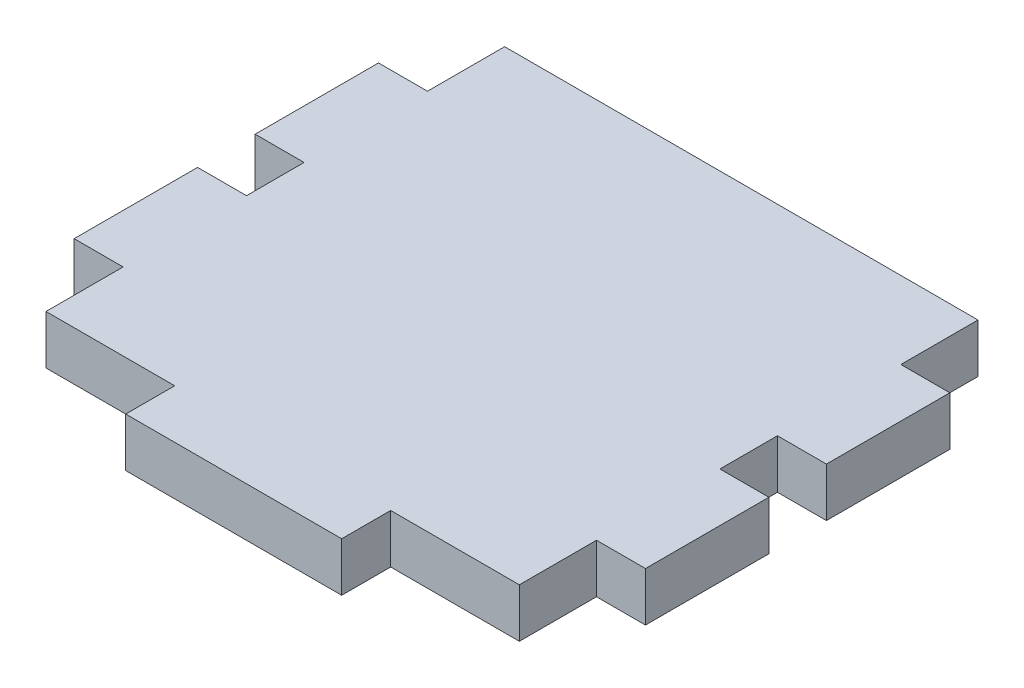
ISO-10303-21;
HEADER;
FILE_DESCRIPTION(('STEP AP214'),'2;1');
FILE_NAME('part.step','',(''),(''),'','','');
FILE_SCHEMA(('AUTOMOTIVE_DESIGN { 1 0 10303 214 1 1 1 1 }'));
ENDSEC;
DATA;
#1=APPLICATION_CONTEXT('core data for automotive mechanical design processes');
#2=APPLICATION_PROTOCOL_DEFINITION('international standard','automotive_design',2000,#1);
#3=PRODUCT_CONTEXT('',#1,'mechanical');
#4=PRODUCT('Part','Part','',(#3));
#5=PRODUCT_RELATED_PRODUCT_CATEGORY('part','',(#4));
#6=PRODUCT_DEFINITION_FORMATION('','',#4);
#7=PRODUCT_DEFINITION_CONTEXT('part definition',#1,'design');
#8=PRODUCT_DEFINITION('design','',#6,#7);
#9=PRODUCT_DEFINITION_SHAPE('','',#8);
#10=(LENGTH_UNIT() NAMED_UNIT(*) SI_UNIT(.MILLI.,.METRE.));
#11=(NAMED_UNIT(*) PLANE_ANGLE_UNIT() SI_UNIT($,.RADIAN.));
#12=(NAMED_UNIT(*) SI_UNIT($,.STERADIAN.) SOLID_ANGLE_UNIT());
#13=UNCERTAINTY_MEASURE_WITH_UNIT(LENGTH_MEASURE(1.E-05),#10,'distance_accuracy_value','');
#14=(GEOMETRIC_REPRESENTATION_CONTEXT(3) GLOBAL_UNCERTAINTY_ASSIGNED_CONTEXT((#13)) GLOBAL_UNIT_ASSIGNED_CONTEXT((#10,
#11,#12)) REPRESENTATION_CONTEXT('',''));
#15=CARTESIAN_POINT('',(0.,0.,0.));
#16=DIRECTION('',(0.,0.,1.));
#17=DIRECTION('',(1.,0.,0.));
#18=AXIS2_PLACEMENT_3D('',#15,#16,#17);
#19=CARTESIAN_POINT('',(0.,3.175,14.865));
#20=DIRECTION('',(0.,0.,-1.));
#21=DIRECTION('',(-1.,0.,0.));
#22=AXIS2_PLACEMENT_3D('',#19,#20,#21);
#23=PLANE('',#22);
#24=DIRECTION('',(0.,-1.,0.));
#25=VECTOR('',#24,1.);
#26=CARTESIAN_POINT('',(-7.,0.,14.865));
#27=LINE('',#26,#25);
#28=CARTESIAN_POINT('',(-7.,3.175,14.865));
#29=VERTEX_POINT('',#28);
#30=CARTESIAN_POINT('',(-7.,0.,14.865));
#31=VERTEX_POINT('',#30);
#32=EDGE_CURVE('E134',#29,#31,#27,.T.);
#33=ORIENTED_EDGE('',*,*,#32,.F.);
#34=DIRECTION('',(1.,0.,0.));
#35=VECTOR('',#34,1.);
#36=CARTESIAN_POINT('',(0.,3.175,14.865));
#37=LINE('',#36,#35);
#38=CARTESIAN_POINT('',(-15.3423,3.175,14.865));
#39=VERTEX_POINT('',#38);
#40=EDGE_CURVE('E330',#39,#29,#37,.T.);
#41=ORIENTED_EDGE('',*,*,#40,.F.);
#42=DIRECTION('',(0.,-1.,0.));
#43=VECTOR('',#42,1.);
#44=CARTESIAN_POINT('',(-15.3423,3.175,14.865));
#45=LINE('',#44,#43);
#46=CARTESIAN_POINT('',(-15.3423,0.,14.865));
#47=VERTEX_POINT('',#46);
#48=EDGE_CURVE('E430',#39,#47,#45,.T.);
#49=ORIENTED_EDGE('',*,*,#48,.T.);
#50=DIRECTION('',(1.,0.,0.));
#51=VECTOR('',#50,1.);
#52=CARTESIAN_POINT('',(0.,0.,14.865));
#53=LINE('',#52,#51);
#54=EDGE_CURVE('E375',#47,#31,#53,.T.);
#55=ORIENTED_EDGE('',*,*,#54,.T.);
#56=EDGE_LOOP('',(#33,#41,#49,#55));
#57=FACE_BOUND('',#56,.T.);
#58=ADVANCED_FACE('F111',(#57),#23,.F.);
#59=CARTESIAN_POINT('',(0.,3.175,9.865));
#60=DIRECTION('',(0.,0.,1.));
#61=DIRECTION('',(1.,0.,0.));
#62=AXIS2_PLACEMENT_3D('',#59,#60,#61);
#63=PLANE('',#62);
#64=DIRECTION('',(-1.,0.,0.));
#65=VECTOR('',#64,1.);
#66=CARTESIAN_POINT('',(0.,0.,9.865));
#67=LINE('',#66,#65);
#68=CARTESIAN_POINT('',(-15.3423,0.,9.865));
#69=VERTEX_POINT('',#68);
#70=CARTESIAN_POINT('',(-18.5173,0.,9.865));
#71=VERTEX_POINT('',#70);
#72=EDGE_CURVE('E372',#69,#71,#67,.T.);
#73=ORIENTED_EDGE('',*,*,#72,.F.);
#74=DIRECTION('',(0.,-1.,0.));
#75=VECTOR('',#74,1.);
#76=CARTESIAN_POINT('',(-15.3423,3.175,9.865));
#77=LINE('',#76,#75);
#78=CARTESIAN_POINT('',(-15.3423,3.175,9.865));
#79=VERTEX_POINT('',#78);
#80=EDGE_CURVE('E432',#79,#69,#77,.T.);
#81=ORIENTED_EDGE('',*,*,#80,.F.);
#82=DIRECTION('',(-1.,0.,0.));
#83=VECTOR('',#82,1.);
#84=CARTESIAN_POINT('',(0.,3.175,9.865));
#85=LINE('',#84,#83);
#86=CARTESIAN_POINT('',(-18.5173,3.175,9.865));
#87=VERTEX_POINT('',#86);
#88=EDGE_CURVE('E327',#79,#87,#85,.T.);
#89=ORIENTED_EDGE('',*,*,#88,.T.);
#90=DIRECTION('',(0.,-1.,0.));
#91=VECTOR('',#90,1.);
#92=CARTESIAN_POINT('',(-18.5173,3.175,9.865));
#93=LINE('',#92,#91);
#94=EDGE_CURVE('E434',#87,#71,#93,.T.);
#95=ORIENTED_EDGE('',*,*,#94,.T.);
#96=EDGE_LOOP('',(#73,#81,#89,#95));
#97=FACE_BOUND('',#96,.T.);
#98=ADVANCED_FACE('F496',(#97),#63,.T.);
#99=CARTESIAN_POINT('',(-18.5173,3.175,0.));
#100=DIRECTION('',(1.,0.,0.));
#101=DIRECTION('',(0.,0.,-1.));
#102=AXIS2_PLACEMENT_3D('',#99,#100,#101);
#103=PLANE('',#102);
#104=DIRECTION('',(0.,0.,1.));
#105=VECTOR('',#104,1.);
#106=CARTESIAN_POINT('',(-18.5173,0.,0.));
#107=LINE('',#106,#105);
#108=CARTESIAN_POINT('',(-18.5173,0.,1.865));
#109=VERTEX_POINT('',#108);
#110=EDGE_CURVE('E369',#109,#71,#107,.T.);
#111=ORIENTED_EDGE('',*,*,#110,.T.);
#112=ORIENTED_EDGE('',*,*,#94,.F.);
#113=DIRECTION('',(0.,0.,1.));
#114=VECTOR('',#113,1.);
#115=CARTESIAN_POINT('',(-18.5173,3.175,0.));
#116=LINE('',#115,#114);
#117=CARTESIAN_POINT('',(-18.5173,3.175,1.865));
#118=VERTEX_POINT('',#117);
#119=EDGE_CURVE('E325',#118,#87,#116,.T.);
#120=ORIENTED_EDGE('',*,*,#119,.F.);
#121=DIRECTION('',(0.,-1.,0.));
#122=VECTOR('',#121,1.);
#123=CARTESIAN_POINT('',(-18.5173,3.175,1.865));
#124=LINE('',#123,#122);
#125=EDGE_CURVE('E436',#118,#109,#124,.T.);
#126=ORIENTED_EDGE('',*,*,#125,.T.);
#127=EDGE_LOOP('',(#111,#112,#120,#126));
#128=FACE_BOUND('',#127,.T.);
#129=ADVANCED_FACE('F498',(#128),#103,.F.);
#130=CARTESIAN_POINT('',(0.,3.175,1.865));
#131=DIRECTION('',(0.,0.,1.));
#132=DIRECTION('',(1.,0.,0.));
#133=AXIS2_PLACEMENT_3D('',#130,#131,#132);
#134=PLANE('',#133);
#135=DIRECTION('',(-1.,0.,0.));
#136=VECTOR('',#135,1.);
#137=CARTESIAN_POINT('',(0.,0.,1.865));
#138=LINE('',#137,#136);
#139=CARTESIAN_POINT('',(-15.3423,0.,1.865));
#140=VERTEX_POINT('',#139);
#141=EDGE_CURVE('E366',#140,#109,#138,.T.);
#142=ORIENTED_EDGE('',*,*,#141,.T.);
#143=ORIENTED_EDGE('',*,*,#125,.F.);
#144=DIRECTION('',(-1.,0.,0.));
#145=VECTOR('',#144,1.);
#146=CARTESIAN_POINT('',(0.,3.175,1.865));
#147=LINE('',#146,#145);
#148=CARTESIAN_POINT('',(-15.3423,3.175,1.865));
#149=VERTEX_POINT('',#148);
#150=EDGE_CURVE('E321',#149,#118,#147,.T.);
#151=ORIENTED_EDGE('',*,*,#150,.F.);
#152=DIRECTION('',(0.,-1.,0.));
#153=VECTOR('',#152,1.);
#154=CARTESIAN_POINT('',(-15.3423,3.175,1.865));
#155=LINE('',#154,#153);
#156=EDGE_CURVE('E439',#149,#140,#155,.T.);
#157=ORIENTED_EDGE('',*,*,#156,.T.);
#158=EDGE_LOOP('',(#142,#143,#151,#157));
#159=FACE_BOUND('',#158,.T.);
#160=ADVANCED_FACE('F501',(#159),#134,.F.);
#161=CARTESIAN_POINT('',(7.,3.175,14.865));
#162=VERTEX_POINT('',#161);
#163=CARTESIAN_POINT('',(15.3423,3.175,14.865));
#164=VERTEX_POINT('',#163);
#165=EDGE_CURVE('E126',#162,#164,#37,.T.);
#166=ORIENTED_EDGE('',*,*,#165,.F.);
#167=DIRECTION('',(0.,-1.,0.));
#168=VECTOR('',#167,1.);
#169=CARTESIAN_POINT('',(7.,0.,14.865));
#170=LINE('',#169,#168);
#171=CARTESIAN_POINT('',(7.,0.,14.865));
#172=VERTEX_POINT('',#171);
#173=EDGE_CURVE('E279',#162,#172,#170,.T.);
#174=ORIENTED_EDGE('',*,*,#173,.T.);
#175=CARTESIAN_POINT('',(15.3423,0.,14.865));
#176=VERTEX_POINT('',#175);
#177=EDGE_CURVE('E378',#172,#176,#53,.T.);
#178=ORIENTED_EDGE('',*,*,#177,.T.);
#179=DIRECTION('',(0.,-1.,0.));
#180=VECTOR('',#179,1.);
#181=CARTESIAN_POINT('',(15.3423,3.175,14.865));
#182=LINE('',#181,#180);
#183=EDGE_CURVE('E427',#164,#176,#182,.T.);
#184=ORIENTED_EDGE('',*,*,#183,.F.);
#185=EDGE_LOOP('',(#166,#174,#178,#184));
#186=FACE_BOUND('',#185,.T.);
#187=ADVANCED_FACE('F473',(#186),#23,.F.);
#188=CARTESIAN_POINT('',(15.3423,3.175,0.));
#189=DIRECTION('',(-1.,0.,0.));
#190=DIRECTION('',(0.,0.,1.));
#191=AXIS2_PLACEMENT_3D('',#188,#189,#190);
#192=PLANE('',#191);
#193=DIRECTION('',(0.,0.,-1.));
#194=VECTOR('',#193,1.);
#195=CARTESIAN_POINT('',(15.3423,0.,0.));
#196=LINE('',#195,#194);
#197=CARTESIAN_POINT('',(15.3423,0.,9.865));
#198=VERTEX_POINT('',#197);
#199=EDGE_CURVE('E377',#176,#198,#196,.T.);
#200=ORIENTED_EDGE('',*,*,#199,.T.);
#201=DIRECTION('',(0.,-1.,0.));
#202=VECTOR('',#201,1.);
#203=CARTESIAN_POINT('',(15.3423,3.175,9.865));
#204=LINE('',#203,#202);
#205=CARTESIAN_POINT('',(15.3423,3.175,9.865));
#206=VERTEX_POINT('',#205);
#207=EDGE_CURVE('E424',#206,#198,#204,.T.);
#208=ORIENTED_EDGE('',*,*,#207,.F.);
#209=DIRECTION('',(0.,0.,-1.));
#210=VECTOR('',#209,1.);
#211=CARTESIAN_POINT('',(15.3423,3.175,0.));
#212=LINE('',#211,#210);
#213=EDGE_CURVE('E332',#164,#206,#212,.T.);
#214=ORIENTED_EDGE('',*,*,#213,.F.);
#215=ORIENTED_EDGE('',*,*,#183,.T.);
#216=EDGE_LOOP('',(#200,#208,#214,#215));
#217=FACE_BOUND('',#216,.T.);
#218=ADVANCED_FACE('F477',(#217),#192,.F.);
#219=CARTESIAN_POINT('',(0.,3.175,9.86500000000001));
#220=DIRECTION('',(0.,0.,-1.));
#221=DIRECTION('',(-1.,0.,0.));
#222=AXIS2_PLACEMENT_3D('',#219,#220,#221);
#223=PLANE('',#222);
#224=DIRECTION('',(1.,0.,0.));
#225=VECTOR('',#224,1.);
#226=CARTESIAN_POINT('',(0.,0.,9.86500000000001));
#227=LINE('',#226,#225);
#228=CARTESIAN_POINT('',(18.5173,0.,9.865));
#229=VERTEX_POINT('',#228);
#230=EDGE_CURVE('E380',#198,#229,#227,.T.);
#231=ORIENTED_EDGE('',*,*,#230,.T.);
#232=DIRECTION('',(0.,-1.,0.));
#233=VECTOR('',#232,1.);
#234=CARTESIAN_POINT('',(18.5173,3.175,9.865));
#235=LINE('',#234,#233);
#236=CARTESIAN_POINT('',(18.5173,3.175,9.865));
#237=VERTEX_POINT('',#236);
#238=EDGE_CURVE('E422',#237,#229,#235,.T.);
#239=ORIENTED_EDGE('',*,*,#238,.F.);
#240=DIRECTION('',(1.,0.,0.));
#241=VECTOR('',#240,1.);
#242=CARTESIAN_POINT('',(0.,3.175,9.86500000000001));
#243=LINE('',#242,#241);
#244=EDGE_CURVE('E334',#206,#237,#243,.T.);
#245=ORIENTED_EDGE('',*,*,#244,.F.);
#246=ORIENTED_EDGE('',*,*,#207,.T.);
#247=EDGE_LOOP('',(#231,#239,#245,#246));
#248=FACE_BOUND('',#247,.T.);
#249=ADVANCED_FACE('F483',(#248),#223,.F.);
#250=CARTESIAN_POINT('',(18.5173,3.175,0.));
#251=DIRECTION('',(1.,0.,0.));
#252=DIRECTION('',(0.,0.,-1.));
#253=AXIS2_PLACEMENT_3D('',#250,#251,#252);
#254=PLANE('',#253);
#255=DIRECTION('',(0.,0.,1.));
#256=VECTOR('',#255,1.);
#257=CARTESIAN_POINT('',(18.5173,0.,0.));
#258=LINE('',#257,#256);
#259=CARTESIAN_POINT('',(18.5173,0.,1.865));
#260=VERTEX_POINT('',#259);
#261=EDGE_CURVE('E385',#260,#229,#258,.T.);
#262=ORIENTED_EDGE('',*,*,#261,.F.);
#263=DIRECTION('',(0.,-1.,0.));
#264=VECTOR('',#263,1.);
#265=CARTESIAN_POINT('',(18.5173,3.175,1.865));
#266=LINE('',#265,#264);
#267=CARTESIAN_POINT('',(18.5173,3.175,1.865));
#268=VERTEX_POINT('',#267);
#269=EDGE_CURVE('E420',#268,#260,#266,.T.);
#270=ORIENTED_EDGE('',*,*,#269,.F.);
#271=DIRECTION('',(0.,0.,1.));
#272=VECTOR('',#271,1.);
#273=CARTESIAN_POINT('',(18.5173,3.175,0.));
#274=LINE('',#273,#272);
#275=EDGE_CURVE('E338',#268,#237,#274,.T.);
#276=ORIENTED_EDGE('',*,*,#275,.T.);
#277=ORIENTED_EDGE('',*,*,#238,.T.);
#278=EDGE_LOOP('',(#262,#270,#276,#277));
#279=FACE_BOUND('',#278,.T.);
#280=ADVANCED_FACE('F522',(#279),#254,.T.);
#281=CARTESIAN_POINT('',(0.,3.175,1.865));
#282=DIRECTION('',(0.,0.,-1.));
#283=DIRECTION('',(-1.,0.,0.));
#284=AXIS2_PLACEMENT_3D('',#281,#282,#283);
#285=PLANE('',#284);
#286=DIRECTION('',(1.,0.,0.));
#287=VECTOR('',#286,1.);
#288=CARTESIAN_POINT('',(0.,0.,1.865));
#289=LINE('',#288,#287);
#290=CARTESIAN_POINT('',(15.3423,0.,1.865));
#291=VERTEX_POINT('',#290);
#292=EDGE_CURVE('E388',#291,#260,#289,.T.);
#293=ORIENTED_EDGE('',*,*,#292,.F.);
#294=DIRECTION('',(0.,-1.,0.));
#295=VECTOR('',#294,1.);
#296=CARTESIAN_POINT('',(15.3423,3.175,1.865));
#297=LINE('',#296,#295);
#298=CARTESIAN_POINT('',(15.3423,3.175,1.865));
#299=VERTEX_POINT('',#298);
#300=EDGE_CURVE('E418',#299,#291,#297,.T.);
#301=ORIENTED_EDGE('',*,*,#300,.F.);
#302=DIRECTION('',(1.,0.,0.));
#303=VECTOR('',#302,1.);
#304=CARTESIAN_POINT('',(0.,3.175,1.865));
#305=LINE('',#304,#303);
#306=EDGE_CURVE('E341',#299,#268,#305,.T.);
#307=ORIENTED_EDGE('',*,*,#306,.T.);
#308=ORIENTED_EDGE('',*,*,#269,.T.);
#309=EDGE_LOOP('',(#293,#301,#307,#308));
#310=FACE_BOUND('',#309,.T.);
#311=ADVANCED_FACE('F525',(#310),#285,.T.);
#312=CARTESIAN_POINT('',(15.3423,0.,-1.865));
#313=VERTEX_POINT('',#312);
#314=EDGE_CURVE('E382',#291,#313,#196,.T.);
#315=ORIENTED_EDGE('',*,*,#314,.T.);
#316=DIRECTION('',(0.,-1.,0.));
#317=VECTOR('',#316,1.);
#318=CARTESIAN_POINT('',(15.3423,3.175,-1.865));
#319=LINE('',#318,#317);
#320=CARTESIAN_POINT('',(15.3423,3.175,-1.865));
#321=VERTEX_POINT('',#320);
#322=EDGE_CURVE('E415',#321,#313,#319,.T.);
#323=ORIENTED_EDGE('',*,*,#322,.F.);
#324=EDGE_CURVE('E336',#299,#321,#212,.T.);
#325=ORIENTED_EDGE('',*,*,#324,.F.);
#326=ORIENTED_EDGE('',*,*,#300,.T.);
#327=EDGE_LOOP('',(#315,#323,#325,#326));
#328=FACE_BOUND('',#327,.T.);
#329=ADVANCED_FACE('F529',(#328),#192,.F.);
#330=CARTESIAN_POINT('',(0.,3.175,-1.865));
#331=DIRECTION('',(0.,0.,-1.));
#332=DIRECTION('',(-1.,0.,0.));
#333=AXIS2_PLACEMENT_3D('',#330,#331,#332);
#334=PLANE('',#333);
#335=DIRECTION('',(1.,0.,0.));
#336=VECTOR('',#335,1.);
#337=CARTESIAN_POINT('',(0.,0.,-1.865));
#338=LINE('',#337,#336);
#339=CARTESIAN_POINT('',(18.5173,0.,-1.865));
#340=VERTEX_POINT('',#339);
#341=EDGE_CURVE('E391',#313,#340,#338,.T.);
#342=ORIENTED_EDGE('',*,*,#341,.T.);
#343=DIRECTION('',(0.,-1.,0.));
#344=VECTOR('',#343,1.);
#345=CARTESIAN_POINT('',(18.5173,3.175,-1.865));
#346=LINE('',#345,#344);
#347=CARTESIAN_POINT('',(18.5173,3.175,-1.865));
#348=VERTEX_POINT('',#347);
#349=EDGE_CURVE('E413',#348,#340,#346,.T.);
#350=ORIENTED_EDGE('',*,*,#349,.F.);
#351=DIRECTION('',(1.,0.,0.));
#352=VECTOR('',#351,1.);
#353=CARTESIAN_POINT('',(0.,3.175,-1.865));
#354=LINE('',#353,#352);
#355=EDGE_CURVE('E344',#321,#348,#354,.T.);
#356=ORIENTED_EDGE('',*,*,#355,.F.);
#357=ORIENTED_EDGE('',*,*,#322,.T.);
#358=EDGE_LOOP('',(#342,#350,#356,#357));
#359=FACE_BOUND('',#358,.T.);
#360=ADVANCED_FACE('F531',(#359),#334,.F.);
#361=CARTESIAN_POINT('',(18.5173,3.175,0.));
#362=DIRECTION('',(1.,0.,0.));
#363=DIRECTION('',(0.,0.,-1.));
#364=AXIS2_PLACEMENT_3D('',#361,#362,#363);
#365=PLANE('',#364);
#366=DIRECTION('',(0.,0.,1.));
#367=VECTOR('',#366,1.);
#368=CARTESIAN_POINT('',(18.5173,0.,0.));
#369=LINE('',#368,#367);
#370=CARTESIAN_POINT('',(18.5173,0.,-9.865));
#371=VERTEX_POINT('',#370);
#372=EDGE_CURVE('E394',#371,#340,#369,.T.);
#373=ORIENTED_EDGE('',*,*,#372,.F.);
#374=DIRECTION('',(0.,-1.,0.));
#375=VECTOR('',#374,1.);
#376=CARTESIAN_POINT('',(18.5173,3.175,-9.865));
#377=LINE('',#376,#375);
#378=CARTESIAN_POINT('',(18.5173,3.175,-9.865));
#379=VERTEX_POINT('',#378);
#380=EDGE_CURVE('E411',#379,#371,#377,.T.);
#381=ORIENTED_EDGE('',*,*,#380,.F.);
#382=DIRECTION('',(0.,0.,1.));
#383=VECTOR('',#382,1.);
#384=CARTESIAN_POINT('',(18.5173,3.175,0.));
#385=LINE('',#384,#383);
#386=EDGE_CURVE('E346',#379,#348,#385,.T.);
#387=ORIENTED_EDGE('',*,*,#386,.T.);
#388=ORIENTED_EDGE('',*,*,#349,.T.);
#389=EDGE_LOOP('',(#373,#381,#387,#388));
#390=FACE_BOUND('',#389,.T.);
#391=ADVANCED_FACE('F534',(#390),#365,.T.);
#392=CARTESIAN_POINT('',(0.,3.175,-9.86499999999999));
#393=DIRECTION('',(0.,0.,-1.));
#394=DIRECTION('',(-1.,0.,0.));
#395=AXIS2_PLACEMENT_3D('',#392,#393,#394);
#396=PLANE('',#395);
#397=DIRECTION('',(1.,0.,0.));
#398=VECTOR('',#397,1.);
#399=CARTESIAN_POINT('',(0.,0.,-9.86499999999999));
#400=LINE('',#399,#398);
#401=CARTESIAN_POINT('',(15.3423,0.,-9.865));
#402=VERTEX_POINT('',#401);
#403=EDGE_CURVE('E397',#402,#371,#400,.T.);
#404=ORIENTED_EDGE('',*,*,#403,.F.);
#405=DIRECTION('',(0.,-1.,0.));
#406=VECTOR('',#405,1.);
#407=CARTESIAN_POINT('',(15.3423,3.175,-9.865));
#408=LINE('',#407,#406);
#409=CARTESIAN_POINT('',(15.3423,3.175,-9.865));
#410=VERTEX_POINT('',#409);
#411=EDGE_CURVE('E409',#410,#402,#408,.T.);
#412=ORIENTED_EDGE('',*,*,#411,.F.);
#413=DIRECTION('',(1.,0.,0.));
#414=VECTOR('',#413,1.);
#415=CARTESIAN_POINT('',(0.,3.175,-9.86499999999999));
#416=LINE('',#415,#414);
#417=EDGE_CURVE('E349',#410,#379,#416,.T.);
#418=ORIENTED_EDGE('',*,*,#417,.T.);
#419=ORIENTED_EDGE('',*,*,#380,.T.);
#420=EDGE_LOOP('',(#404,#412,#418,#419));
#421=FACE_BOUND('',#420,.T.);
#422=ADVANCED_FACE('F538',(#421),#396,.T.);
#423=CARTESIAN_POINT('',(15.3423,0.,-14.865));
#424=VERTEX_POINT('',#423);
#425=EDGE_CURVE('E381',#402,#424,#196,.T.);
#426=ORIENTED_EDGE('',*,*,#425,.T.);
#427=DIRECTION('',(0.,-1.,0.));
#428=VECTOR('',#427,1.);
#429=CARTESIAN_POINT('',(15.3423,3.175,-14.865));
#430=LINE('',#429,#428);
#431=CARTESIAN_POINT('',(15.3423,3.175,-14.865));
#432=VERTEX_POINT('',#431);
#433=EDGE_CURVE('E407',#432,#424,#430,.T.);
#434=ORIENTED_EDGE('',*,*,#433,.F.);
#435=EDGE_CURVE('E335',#410,#432,#212,.T.);
#436=ORIENTED_EDGE('',*,*,#435,.F.);
#437=ORIENTED_EDGE('',*,*,#411,.T.);
#438=EDGE_LOOP('',(#426,#434,#436,#437));
#439=FACE_BOUND('',#438,.T.);
#440=ADVANCED_FACE('F542',(#439),#192,.F.);
#441=CARTESIAN_POINT('',(0.,3.175,-14.865));
#442=DIRECTION('',(0.,0.,-1.));
#443=DIRECTION('',(-1.,0.,0.));
#444=AXIS2_PLACEMENT_3D('',#441,#442,#443);
#445=PLANE('',#444);
#446=DIRECTION('',(1.,0.,0.));
#447=VECTOR('',#446,1.);
#448=CARTESIAN_POINT('',(0.,0.,-14.865));
#449=LINE('',#448,#447);
#450=CARTESIAN_POINT('',(-15.3423,0.,-14.865));
#451=VERTEX_POINT('',#450);
#452=EDGE_CURVE('E400',#451,#424,#449,.T.);
#453=ORIENTED_EDGE('',*,*,#452,.F.);
#454=DIRECTION('',(0.,-1.,0.));
#455=VECTOR('',#454,1.);
#456=CARTESIAN_POINT('',(-15.3423,3.175,-14.865));
#457=LINE('',#456,#455);
#458=CARTESIAN_POINT('',(-15.3423,3.175,-14.865));
#459=VERTEX_POINT('',#458);
#460=EDGE_CURVE('E405',#459,#451,#457,.T.);
#461=ORIENTED_EDGE('',*,*,#460,.F.);
#462=DIRECTION('',(1.,0.,0.));
#463=VECTOR('',#462,1.);
#464=CARTESIAN_POINT('',(0.,3.175,-14.865));
#465=LINE('',#464,#463);
#466=EDGE_CURVE('E352',#459,#432,#465,.T.);
#467=ORIENTED_EDGE('',*,*,#466,.T.);
#468=ORIENTED_EDGE('',*,*,#433,.T.);
#469=EDGE_LOOP('',(#453,#461,#467,#468));
#470=FACE_BOUND('',#469,.T.);
#471=ADVANCED_FACE('F546',(#470),#445,.T.);
#472=CARTESIAN_POINT('',(-15.3423,3.175,0.));
#473=DIRECTION('',(-1.,0.,0.));
#474=DIRECTION('',(0.,0.,1.));
#475=AXIS2_PLACEMENT_3D('',#472,#473,#474);
#476=PLANE('',#475);
#477=DIRECTION('',(0.,0.,-1.));
#478=VECTOR('',#477,1.);
#479=CARTESIAN_POINT('',(-15.3423,0.,0.));
#480=LINE('',#479,#478);
#481=CARTESIAN_POINT('',(-15.3423,0.,-9.865));
#482=VERTEX_POINT('',#481);
#483=EDGE_CURVE('E313',#482,#451,#480,.T.);
#484=ORIENTED_EDGE('',*,*,#483,.F.);
#485=DIRECTION('',(0.,-1.,0.));
#486=VECTOR('',#485,1.);
#487=CARTESIAN_POINT('',(-15.3423,3.175,-9.865));
#488=LINE('',#487,#486);
#489=CARTESIAN_POINT('',(-15.3423,3.175,-9.865));
#490=VERTEX_POINT('',#489);
#491=EDGE_CURVE('E403',#490,#482,#488,.T.);
#492=ORIENTED_EDGE('',*,*,#491,.F.);
#493=DIRECTION('',(0.,0.,-1.));
#494=VECTOR('',#493,1.);
#495=CARTESIAN_POINT('',(-15.3423,3.175,0.));
#496=LINE('',#495,#494);
#497=EDGE_CURVE('E322',#490,#459,#496,.T.);
#498=ORIENTED_EDGE('',*,*,#497,.T.);
#499=ORIENTED_EDGE('',*,*,#460,.T.);
#500=EDGE_LOOP('',(#484,#492,#498,#499));
#501=FACE_BOUND('',#500,.T.);
#502=ADVANCED_FACE('F468',(#501),#476,.T.);
#503=CARTESIAN_POINT('',(0.,3.175,-9.86499999999999));
#504=DIRECTION('',(0.,0.,1.));
#505=DIRECTION('',(1.,0.,0.));
#506=AXIS2_PLACEMENT_3D('',#503,#504,#505);
#507=PLANE('',#506);
#508=DIRECTION('',(-1.,0.,0.));
#509=VECTOR('',#508,1.);
#510=CARTESIAN_POINT('',(0.,0.,-9.86499999999999));
#511=LINE('',#510,#509);
#512=CARTESIAN_POINT('',(-18.5173,0.,-9.865));
#513=VERTEX_POINT('',#512);
#514=EDGE_CURVE('E281',#482,#513,#511,.T.);
#515=ORIENTED_EDGE('',*,*,#514,.T.);
#516=DIRECTION('',(0.,-1.,0.));
#517=VECTOR('',#516,1.);
#518=CARTESIAN_POINT('',(-18.5173,3.175,-9.865));
#519=LINE('',#518,#517);
#520=CARTESIAN_POINT('',(-18.5173,3.175,-9.865));
#521=VERTEX_POINT('',#520);
#522=EDGE_CURVE('E12',#521,#513,#519,.T.);
#523=ORIENTED_EDGE('',*,*,#522,.F.);
#524=DIRECTION('',(-1.,0.,0.));
#525=VECTOR('',#524,1.);
#526=CARTESIAN_POINT('',(0.,3.175,-9.86499999999999));
#527=LINE('',#526,#525);
#528=EDGE_CURVE('E309',#490,#521,#527,.T.);
#529=ORIENTED_EDGE('',*,*,#528,.F.);
#530=ORIENTED_EDGE('',*,*,#491,.T.);
#531=EDGE_LOOP('',(#515,#523,#529,#530));
#532=FACE_BOUND('',#531,.T.);
#533=ADVANCED_FACE('F113',(#532),#507,.F.);
#534=CARTESIAN_POINT('',(-18.5173,3.175,0.));
#535=DIRECTION('',(1.,0.,0.));
#536=DIRECTION('',(0.,0.,-1.));
#537=AXIS2_PLACEMENT_3D('',#534,#535,#536);
#538=PLANE('',#537);
#539=DIRECTION('',(0.,0.,1.));
#540=VECTOR('',#539,1.);
#541=CARTESIAN_POINT('',(-18.5173,0.,0.));
#542=LINE('',#541,#540);
#543=CARTESIAN_POINT('',(-18.5173,0.,-1.865));
#544=VERTEX_POINT('',#543);
#545=EDGE_CURVE('E357',#513,#544,#542,.T.);
#546=ORIENTED_EDGE('',*,*,#545,.T.);
#547=DIRECTION('',(0.,-1.,0.));
#548=VECTOR('',#547,1.);
#549=CARTESIAN_POINT('',(-18.5173,3.175,-1.865));
#550=LINE('',#549,#548);
#551=CARTESIAN_POINT('',(-18.5173,3.175,-1.865));
#552=VERTEX_POINT('',#551);
#553=EDGE_CURVE('E119',#552,#544,#550,.T.);
#554=ORIENTED_EDGE('',*,*,#553,.F.);
#555=DIRECTION('',(0.,0.,1.));
#556=VECTOR('',#555,1.);
#557=CARTESIAN_POINT('',(-18.5173,3.175,0.));
#558=LINE('',#557,#556);
#559=EDGE_CURVE('E312',#521,#552,#558,.T.);
#560=ORIENTED_EDGE('',*,*,#559,.F.);
#561=ORIENTED_EDGE('',*,*,#522,.T.);
#562=EDGE_LOOP('',(#546,#554,#560,#561));
#563=FACE_BOUND('',#562,.T.);
#564=ADVANCED_FACE('F448',(#563),#538,.F.);
#565=CARTESIAN_POINT('',(0.,3.175,-1.865));
#566=DIRECTION('',(0.,0.,1.));
#567=DIRECTION('',(1.,0.,0.));
#568=AXIS2_PLACEMENT_3D('',#565,#566,#567);
#569=PLANE('',#568);
#570=DIRECTION('',(-1.,0.,0.));
#571=VECTOR('',#570,1.);
#572=CARTESIAN_POINT('',(0.,0.,-1.865));
#573=LINE('',#572,#571);
#574=CARTESIAN_POINT('',(-15.3423,0.,-1.865));
#575=VERTEX_POINT('',#574);
#576=EDGE_CURVE('E360',#575,#544,#573,.T.);
#577=ORIENTED_EDGE('',*,*,#576,.F.);
#578=DIRECTION('',(0.,-1.,0.));
#579=VECTOR('',#578,1.);
#580=CARTESIAN_POINT('',(-15.3423,3.175,-1.865));
#581=LINE('',#580,#579);
#582=CARTESIAN_POINT('',(-15.3423,3.175,-1.865));
#583=VERTEX_POINT('',#582);
#584=EDGE_CURVE('E441',#583,#575,#581,.T.);
#585=ORIENTED_EDGE('',*,*,#584,.F.);
#586=DIRECTION('',(-1.,0.,0.));
#587=VECTOR('',#586,1.);
#588=CARTESIAN_POINT('',(0.,3.175,-1.865));
#589=LINE('',#588,#587);
#590=EDGE_CURVE('E315',#583,#552,#589,.T.);
#591=ORIENTED_EDGE('',*,*,#590,.T.);
#592=ORIENTED_EDGE('',*,*,#553,.T.);
#593=EDGE_LOOP('',(#577,#585,#591,#592));
#594=FACE_BOUND('',#593,.T.);
#595=ADVANCED_FACE('F445',(#594),#569,.T.);
#596=EDGE_CURVE('E363',#140,#575,#480,.T.);
#597=ORIENTED_EDGE('',*,*,#596,.F.);
#598=ORIENTED_EDGE('',*,*,#156,.F.);
#599=EDGE_CURVE('E318',#149,#583,#496,.T.);
#600=ORIENTED_EDGE('',*,*,#599,.T.);
#601=ORIENTED_EDGE('',*,*,#584,.T.);
#602=EDGE_LOOP('',(#597,#598,#600,#601));
#603=FACE_BOUND('',#602,.T.);
#604=ADVANCED_FACE('F458',(#603),#476,.T.);
#605=EDGE_CURVE('E367',#47,#69,#480,.T.);
#606=ORIENTED_EDGE('',*,*,#605,.F.);
#607=ORIENTED_EDGE('',*,*,#48,.F.);
#608=EDGE_CURVE('E323',#39,#79,#496,.T.);
#609=ORIENTED_EDGE('',*,*,#608,.T.);
#610=ORIENTED_EDGE('',*,*,#80,.T.);
#611=EDGE_LOOP('',(#606,#607,#609,#610));
#612=FACE_BOUND('',#611,.T.);
#613=ADVANCED_FACE('F490',(#612),#476,.T.);
#614=CARTESIAN_POINT('',(0.,0.,0.));
#615=DIRECTION('',(0.,1.,0.));
#616=DIRECTION('',(0.,0.,1.));
#617=AXIS2_PLACEMENT_3D('',#614,#615,#616);
#618=PLANE('',#617);
#619=ORIENTED_EDGE('',*,*,#605,.T.);
#620=ORIENTED_EDGE('',*,*,#72,.T.);
#621=ORIENTED_EDGE('',*,*,#110,.F.);
#622=ORIENTED_EDGE('',*,*,#141,.F.);
#623=ORIENTED_EDGE('',*,*,#596,.T.);
#624=ORIENTED_EDGE('',*,*,#576,.T.);
#625=ORIENTED_EDGE('',*,*,#545,.F.);
#626=ORIENTED_EDGE('',*,*,#514,.F.);
#627=ORIENTED_EDGE('',*,*,#483,.T.);
#628=ORIENTED_EDGE('',*,*,#452,.T.);
#629=ORIENTED_EDGE('',*,*,#425,.F.);
#630=ORIENTED_EDGE('',*,*,#403,.T.);
#631=ORIENTED_EDGE('',*,*,#372,.T.);
#632=ORIENTED_EDGE('',*,*,#341,.F.);
#633=ORIENTED_EDGE('',*,*,#314,.F.);
#634=ORIENTED_EDGE('',*,*,#292,.T.);
#635=ORIENTED_EDGE('',*,*,#261,.T.);
#636=ORIENTED_EDGE('',*,*,#230,.F.);
#637=ORIENTED_EDGE('',*,*,#199,.F.);
#638=ORIENTED_EDGE('',*,*,#177,.F.);
#639=DIRECTION('',(0.,0.,-1.));
#640=VECTOR('',#639,1.);
#641=CARTESIAN_POINT('',(7.,0.,18.04));
#642=LINE('',#641,#640);
#643=CARTESIAN_POINT('',(7.,0.,18.04));
#644=VERTEX_POINT('',#643);
#645=EDGE_CURVE('E302',#644,#172,#642,.T.);
#646=ORIENTED_EDGE('',*,*,#645,.F.);
#647=DIRECTION('',(1.,0.,0.));
#648=VECTOR('',#647,1.);
#649=CARTESIAN_POINT('',(0.,0.,18.04));
#650=LINE('',#649,#648);
#651=CARTESIAN_POINT('',(-7.,0.,18.04));
#652=VERTEX_POINT('',#651);
#653=EDGE_CURVE('E295',#652,#644,#650,.T.);
#654=ORIENTED_EDGE('',*,*,#653,.F.);
#655=DIRECTION('',(0.,0.,-1.));
#656=VECTOR('',#655,1.);
#657=CARTESIAN_POINT('',(-7.,0.,18.04));
#658=LINE('',#657,#656);
#659=EDGE_CURVE('E305',#652,#31,#658,.T.);
#660=ORIENTED_EDGE('',*,*,#659,.T.);
#661=ORIENTED_EDGE('',*,*,#54,.F.);
#662=EDGE_LOOP('',(#619,#620,#621,#622,#623,#624,#625,#626,#627,#628,#629,#630,#631,#632,#633,
#634,#635,#636,#637,#638,#646,#654,#660,#661));
#663=FACE_BOUND('',#662,.T.);
#664=ADVANCED_FACE('F453',(#663),#618,.F.);
#665=CARTESIAN_POINT('',(0.,3.175,0.));
#666=DIRECTION('',(0.,1.,0.));
#667=DIRECTION('',(0.,0.,1.));
#668=AXIS2_PLACEMENT_3D('',#665,#666,#667);
#669=PLANE('',#668);
#670=ORIENTED_EDGE('',*,*,#599,.F.);
#671=ORIENTED_EDGE('',*,*,#150,.T.);
#672=ORIENTED_EDGE('',*,*,#119,.T.);
#673=ORIENTED_EDGE('',*,*,#88,.F.);
#674=ORIENTED_EDGE('',*,*,#608,.F.);
#675=ORIENTED_EDGE('',*,*,#40,.T.);
#676=DIRECTION('',(0.,0.,-1.));
#677=VECTOR('',#676,1.);
#678=CARTESIAN_POINT('',(-7.,3.175,18.04));
#679=LINE('',#678,#677);
#680=CARTESIAN_POINT('',(-7.,3.175,18.04));
#681=VERTEX_POINT('',#680);
#682=EDGE_CURVE('E282',#681,#29,#679,.T.);
#683=ORIENTED_EDGE('',*,*,#682,.F.);
#684=DIRECTION('',(-1.,0.,0.));
#685=VECTOR('',#684,1.);
#686=CARTESIAN_POINT('',(0.,3.175,18.04));
#687=LINE('',#686,#685);
#688=CARTESIAN_POINT('',(7.,3.175,18.04));
#689=VERTEX_POINT('',#688);
#690=EDGE_CURVE('E285',#689,#681,#687,.T.);
#691=ORIENTED_EDGE('',*,*,#690,.F.);
#692=DIRECTION('',(0.,0.,-1.));
#693=VECTOR('',#692,1.);
#694=CARTESIAN_POINT('',(7.,3.175,18.04));
#695=LINE('',#694,#693);
#696=EDGE_CURVE('E273',#689,#162,#695,.T.);
#697=ORIENTED_EDGE('',*,*,#696,.T.);
#698=ORIENTED_EDGE('',*,*,#165,.T.);
#699=ORIENTED_EDGE('',*,*,#213,.T.);
#700=ORIENTED_EDGE('',*,*,#244,.T.);
#701=ORIENTED_EDGE('',*,*,#275,.F.);
#702=ORIENTED_EDGE('',*,*,#306,.F.);
#703=ORIENTED_EDGE('',*,*,#324,.T.);
#704=ORIENTED_EDGE('',*,*,#355,.T.);
#705=ORIENTED_EDGE('',*,*,#386,.F.);
#706=ORIENTED_EDGE('',*,*,#417,.F.);
#707=ORIENTED_EDGE('',*,*,#435,.T.);
#708=ORIENTED_EDGE('',*,*,#466,.F.);
#709=ORIENTED_EDGE('',*,*,#497,.F.);
#710=ORIENTED_EDGE('',*,*,#528,.T.);
#711=ORIENTED_EDGE('',*,*,#559,.T.);
#712=ORIENTED_EDGE('',*,*,#590,.F.);
#713=EDGE_LOOP('',(#670,#671,#672,#673,#674,#675,#683,#691,#697,#698,#699,#700,#701,#702,#703,
#704,#705,#706,#707,#708,#709,#710,#711,#712));
#714=FACE_BOUND('',#713,.T.);
#715=ADVANCED_FACE('F287',(#714),#669,.T.);
#716=CARTESIAN_POINT('',(7.,0.,18.04));
#717=DIRECTION('',(1.,0.,0.));
#718=DIRECTION('',(0.,0.,-1.));
#719=AXIS2_PLACEMENT_3D('',#716,#717,#718);
#720=PLANE('',#719);
#721=ORIENTED_EDGE('',*,*,#173,.F.);
#722=ORIENTED_EDGE('',*,*,#696,.F.);
#723=DIRECTION('',(0.,-1.,0.));
#724=VECTOR('',#723,1.);
#725=CARTESIAN_POINT('',(7.,0.,18.04));
#726=LINE('',#725,#724);
#727=EDGE_CURVE('E278',#689,#644,#726,.T.);
#728=ORIENTED_EDGE('',*,*,#727,.T.);
#729=ORIENTED_EDGE('',*,*,#645,.T.);
#730=EDGE_LOOP('',(#721,#722,#728,#729));
#731=FACE_BOUND('',#730,.T.);
#732=ADVANCED_FACE('F275',(#731),#720,.T.);
#733=CARTESIAN_POINT('',(-7.,0.,18.04));
#734=DIRECTION('',(1.,0.,0.));
#735=DIRECTION('',(0.,1.,0.));
#736=AXIS2_PLACEMENT_3D('',#733,#734,#735);
#737=PLANE('',#736);
#738=ORIENTED_EDGE('',*,*,#32,.T.);
#739=ORIENTED_EDGE('',*,*,#659,.F.);
#740=DIRECTION('',(0.,-1.,0.));
#741=VECTOR('',#740,1.);
#742=CARTESIAN_POINT('',(-7.,0.,18.04));
#743=LINE('',#742,#741);
#744=EDGE_CURVE('E291',#681,#652,#743,.T.);
#745=ORIENTED_EDGE('',*,*,#744,.F.);
#746=ORIENTED_EDGE('',*,*,#682,.T.);
#747=EDGE_LOOP('',(#738,#739,#745,#746));
#748=FACE_BOUND('',#747,.T.);
#749=ADVANCED_FACE('F512',(#748),#737,.F.);
#750=CARTESIAN_POINT('',(0.,0.,18.04));
#751=DIRECTION('',(0.,0.,1.));
#752=DIRECTION('',(1.,0.,0.));
#753=AXIS2_PLACEMENT_3D('',#750,#751,#752);
#754=PLANE('',#753);
#755=ORIENTED_EDGE('',*,*,#727,.F.);
#756=ORIENTED_EDGE('',*,*,#690,.T.);
#757=ORIENTED_EDGE('',*,*,#744,.T.);
#758=ORIENTED_EDGE('',*,*,#653,.T.);
#759=EDGE_LOOP('',(#755,#756,#757,#758));
#760=FACE_BOUND('',#759,.T.);
#761=ADVANCED_FACE('F293',(#760),#754,.T.);
#762=CLOSED_SHELL('',(#58,#98,#129,#160,#187,#218,#249,#280,#311,#329,#360,#391,#422,#440,#471,
#502,#533,#564,#595,#604,#613,#664,#715,#732,#749,#761));
#763=MANIFOLD_SOLID_BREP('B2',#762);
#764=ADVANCED_BREP_SHAPE_REPRESENTATION('',(#18,#763),#14);
#765=SHAPE_DEFINITION_REPRESENTATION(#9,#764);
ENDSEC;
END-ISO-10303-21;
